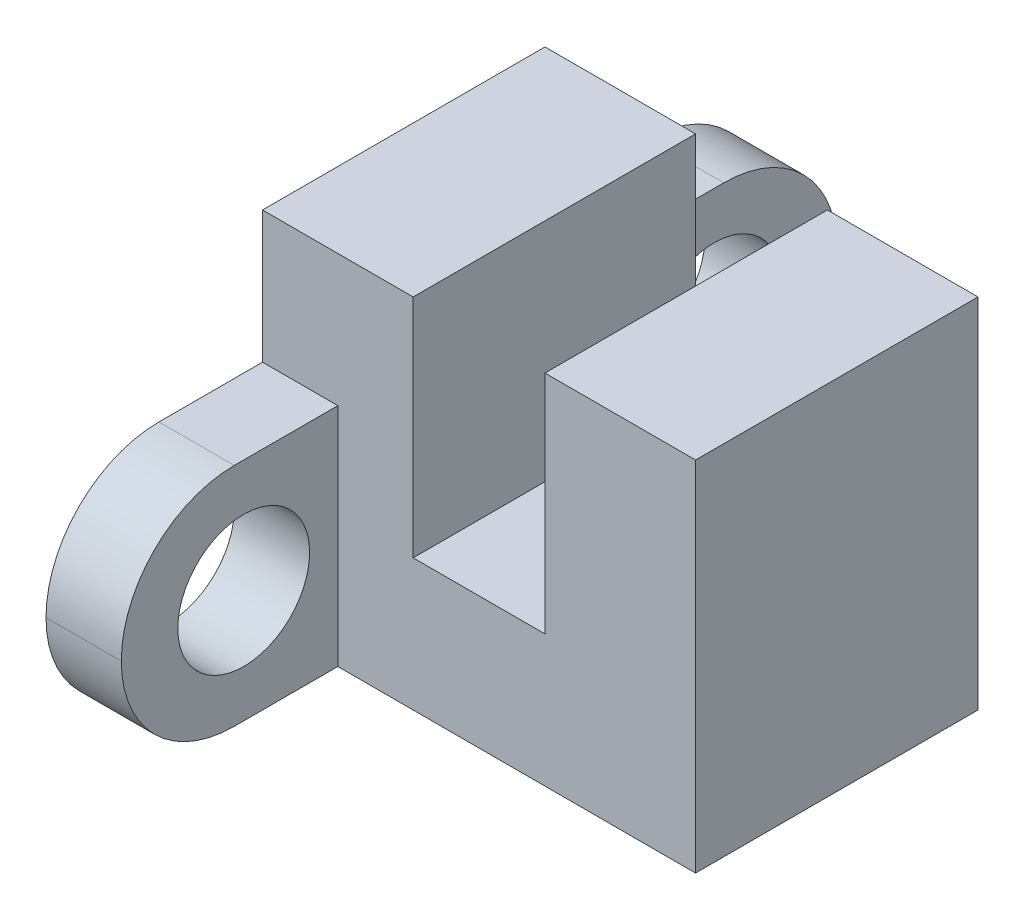
ISO-10303-21;
HEADER;
FILE_DESCRIPTION(('STEP AP214'),'2;1');
FILE_NAME('part.step','',(''),(''),'','','');
FILE_SCHEMA(('AUTOMOTIVE_DESIGN { 1 0 10303 214 1 1 1 1 }'));
ENDSEC;
DATA;
#1=APPLICATION_CONTEXT('core data for automotive mechanical design processes');
#2=APPLICATION_PROTOCOL_DEFINITION('international standard','automotive_design',2000,#1);
#3=PRODUCT_CONTEXT('',#1,'mechanical');
#4=PRODUCT('Part','Part','',(#3));
#5=PRODUCT_RELATED_PRODUCT_CATEGORY('part','',(#4));
#6=PRODUCT_DEFINITION_FORMATION('','',#4);
#7=PRODUCT_DEFINITION_CONTEXT('part definition',#1,'design');
#8=PRODUCT_DEFINITION('design','',#6,#7);
#9=PRODUCT_DEFINITION_SHAPE('','',#8);
#10=(LENGTH_UNIT() NAMED_UNIT(*) SI_UNIT(.MILLI.,.METRE.));
#11=(NAMED_UNIT(*) PLANE_ANGLE_UNIT() SI_UNIT($,.RADIAN.));
#12=(NAMED_UNIT(*) SI_UNIT($,.STERADIAN.) SOLID_ANGLE_UNIT());
#13=UNCERTAINTY_MEASURE_WITH_UNIT(LENGTH_MEASURE(1.E-05),#10,'distance_accuracy_value','');
#14=(GEOMETRIC_REPRESENTATION_CONTEXT(3) GLOBAL_UNCERTAINTY_ASSIGNED_CONTEXT((#13)) GLOBAL_UNIT_ASSIGNED_CONTEXT((#10,
#11,#12)) REPRESENTATION_CONTEXT('',''));
#15=CARTESIAN_POINT('',(0.,0.,0.));
#16=DIRECTION('',(0.,0.,1.));
#17=DIRECTION('',(1.,0.,0.));
#18=AXIS2_PLACEMENT_3D('',#15,#16,#17);
#19=CARTESIAN_POINT('',(0.,9.5,7.5));
#20=DIRECTION('',(0.,1.,0.));
#21=DIRECTION('',(0.,0.,1.));
#22=AXIS2_PLACEMENT_3D('',#19,#20,#21);
#23=PLANE('',#22);
#24=DIRECTION('',(1.,0.,0.));
#25=VECTOR('',#24,1.);
#26=CARTESIAN_POINT('',(0.,9.5,0.));
#27=LINE('',#26,#25);
#28=CARTESIAN_POINT('',(7.5,9.5,0.));
#29=VERTEX_POINT('',#28);
#30=CARTESIAN_POINT('',(11.5,9.5,0.));
#31=VERTEX_POINT('',#30);
#32=EDGE_CURVE('E188',#29,#31,#27,.T.);
#33=ORIENTED_EDGE('',*,*,#32,.F.);
#34=DIRECTION('',(0.,0.,-1.));
#35=VECTOR('',#34,1.);
#36=CARTESIAN_POINT('',(7.5,9.5,7.5));
#37=LINE('',#36,#35);
#38=CARTESIAN_POINT('',(7.5,9.5,7.5));
#39=VERTEX_POINT('',#38);
#40=EDGE_CURVE('E237',#39,#29,#37,.T.);
#41=ORIENTED_EDGE('',*,*,#40,.F.);
#42=DIRECTION('',(1.,0.,0.));
#43=VECTOR('',#42,1.);
#44=CARTESIAN_POINT('',(0.,9.5,7.5));
#45=LINE('',#44,#43);
#46=CARTESIAN_POINT('',(11.5,9.5,7.5));
#47=VERTEX_POINT('',#46);
#48=EDGE_CURVE('E189',#39,#47,#45,.T.);
#49=ORIENTED_EDGE('',*,*,#48,.T.);
#50=DIRECTION('',(0.,0.,-1.));
#51=VECTOR('',#50,1.);
#52=CARTESIAN_POINT('',(11.5,9.5,7.5));
#53=LINE('',#52,#51);
#54=EDGE_CURVE('E208',#47,#31,#53,.T.);
#55=ORIENTED_EDGE('',*,*,#54,.T.);
#56=EDGE_LOOP('',(#33,#41,#49,#55));
#57=FACE_BOUND('',#56,.T.);
#58=ADVANCED_FACE('F32',(#57),#23,.T.);
#59=CARTESIAN_POINT('',(7.5,0.,7.5));
#60=DIRECTION('',(1.,0.,0.));
#61=DIRECTION('',(0.,1.,0.));
#62=AXIS2_PLACEMENT_3D('',#59,#60,#61);
#63=PLANE('',#62);
#64=DIRECTION('',(0.,-1.,0.));
#65=VECTOR('',#64,1.);
#66=CARTESIAN_POINT('',(7.5,0.,0.));
#67=LINE('',#66,#65);
#68=CARTESIAN_POINT('',(7.5,3.5,0.));
#69=VERTEX_POINT('',#68);
#70=EDGE_CURVE('E211',#29,#69,#67,.T.);
#71=ORIENTED_EDGE('',*,*,#70,.T.);
#72=DIRECTION('',(0.,0.,-1.));
#73=VECTOR('',#72,1.);
#74=CARTESIAN_POINT('',(7.5,3.5,7.5));
#75=LINE('',#74,#73);
#76=CARTESIAN_POINT('',(7.5,3.5,7.5));
#77=VERTEX_POINT('',#76);
#78=EDGE_CURVE('E235',#77,#69,#75,.T.);
#79=ORIENTED_EDGE('',*,*,#78,.F.);
#80=DIRECTION('',(0.,-1.,0.));
#81=VECTOR('',#80,1.);
#82=CARTESIAN_POINT('',(7.5,0.,7.5));
#83=LINE('',#82,#81);
#84=EDGE_CURVE('E192',#39,#77,#83,.T.);
#85=ORIENTED_EDGE('',*,*,#84,.F.);
#86=ORIENTED_EDGE('',*,*,#40,.T.);
#87=EDGE_LOOP('',(#71,#79,#85,#86));
#88=FACE_BOUND('',#87,.T.);
#89=ADVANCED_FACE('F323',(#88),#63,.F.);
#90=CARTESIAN_POINT('',(0.,3.5,7.5));
#91=DIRECTION('',(0.,1.,0.));
#92=DIRECTION('',(0.,0.,1.));
#93=AXIS2_PLACEMENT_3D('',#90,#91,#92);
#94=PLANE('',#93);
#95=DIRECTION('',(1.,0.,0.));
#96=VECTOR('',#95,1.);
#97=CARTESIAN_POINT('',(0.,3.5,0.));
#98=LINE('',#97,#96);
#99=CARTESIAN_POINT('',(4.,3.5,0.));
#100=VERTEX_POINT('',#99);
#101=EDGE_CURVE('E214',#100,#69,#98,.T.);
#102=ORIENTED_EDGE('',*,*,#101,.F.);
#103=DIRECTION('',(0.,0.,-1.));
#104=VECTOR('',#103,1.);
#105=CARTESIAN_POINT('',(4.,3.5,7.5));
#106=LINE('',#105,#104);
#107=CARTESIAN_POINT('',(4.,3.5,7.5));
#108=VERTEX_POINT('',#107);
#109=EDGE_CURVE('E233',#108,#100,#106,.T.);
#110=ORIENTED_EDGE('',*,*,#109,.F.);
#111=DIRECTION('',(1.,0.,0.));
#112=VECTOR('',#111,1.);
#113=CARTESIAN_POINT('',(0.,3.5,7.5));
#114=LINE('',#113,#112);
#115=EDGE_CURVE('E196',#108,#77,#114,.T.);
#116=ORIENTED_EDGE('',*,*,#115,.T.);
#117=ORIENTED_EDGE('',*,*,#78,.T.);
#118=EDGE_LOOP('',(#102,#110,#116,#117));
#119=FACE_BOUND('',#118,.T.);
#120=ADVANCED_FACE('F328',(#119),#94,.T.);
#121=CARTESIAN_POINT('',(4.,0.,7.5));
#122=DIRECTION('',(1.,0.,0.));
#123=DIRECTION('',(0.,1.,0.));
#124=AXIS2_PLACEMENT_3D('',#121,#122,#123);
#125=PLANE('',#124);
#126=DIRECTION('',(0.,-1.,0.));
#127=VECTOR('',#126,1.);
#128=CARTESIAN_POINT('',(4.,0.,0.));
#129=LINE('',#128,#127);
#130=CARTESIAN_POINT('',(4.,9.5,0.));
#131=VERTEX_POINT('',#130);
#132=EDGE_CURVE('E217',#131,#100,#129,.T.);
#133=ORIENTED_EDGE('',*,*,#132,.F.);
#134=DIRECTION('',(0.,0.,-1.));
#135=VECTOR('',#134,1.);
#136=CARTESIAN_POINT('',(4.,9.5,7.5));
#137=LINE('',#136,#135);
#138=CARTESIAN_POINT('',(4.,9.5,7.5));
#139=VERTEX_POINT('',#138);
#140=EDGE_CURVE('E231',#139,#131,#137,.T.);
#141=ORIENTED_EDGE('',*,*,#140,.F.);
#142=DIRECTION('',(0.,-1.,0.));
#143=VECTOR('',#142,1.);
#144=CARTESIAN_POINT('',(4.,0.,7.5));
#145=LINE('',#144,#143);
#146=EDGE_CURVE('E199',#139,#108,#145,.T.);
#147=ORIENTED_EDGE('',*,*,#146,.T.);
#148=ORIENTED_EDGE('',*,*,#109,.T.);
#149=EDGE_LOOP('',(#133,#141,#147,#148));
#150=FACE_BOUND('',#149,.T.);
#151=ADVANCED_FACE('F319',(#150),#125,.T.);
#152=CARTESIAN_POINT('',(0.,9.5,0.));
#153=VERTEX_POINT('',#152);
#154=EDGE_CURVE('E158',#153,#131,#27,.T.);
#155=ORIENTED_EDGE('',*,*,#154,.F.);
#156=DIRECTION('',(0.,0.,-1.));
#157=VECTOR('',#156,1.);
#158=CARTESIAN_POINT('',(0.,9.5,7.5));
#159=LINE('',#158,#157);
#160=CARTESIAN_POINT('',(0.,9.5,7.5));
#161=VERTEX_POINT('',#160);
#162=EDGE_CURVE('E153',#161,#153,#159,.T.);
#163=ORIENTED_EDGE('',*,*,#162,.F.);
#164=EDGE_CURVE('E194',#161,#139,#45,.T.);
#165=ORIENTED_EDGE('',*,*,#164,.T.);
#166=ORIENTED_EDGE('',*,*,#140,.T.);
#167=EDGE_LOOP('',(#155,#163,#165,#166));
#168=FACE_BOUND('',#167,.T.);
#169=ADVANCED_FACE('F311',(#168),#23,.T.);
#170=CARTESIAN_POINT('',(0.,0.,7.5));
#171=DIRECTION('',(-1.,0.,0.));
#172=DIRECTION('',(0.,0.,1.));
#173=AXIS2_PLACEMENT_3D('',#170,#171,#172);
#174=PLANE('',#173);
#175=DIRECTION('',(0.,0.,-1.));
#176=VECTOR('',#175,1.);
#177=CARTESIAN_POINT('',(0.,0.,7.5));
#178=LINE('',#177,#176);
#179=CARTESIAN_POINT('',(0.,0.,10.25));
#180=VERTEX_POINT('',#179);
#181=CARTESIAN_POINT('',(0.,0.,-2.75));
#182=VERTEX_POINT('',#181);
#183=EDGE_CURVE('E227',#180,#182,#178,.T.);
#184=ORIENTED_EDGE('',*,*,#183,.F.);
#185=CARTESIAN_POINT('',(0.,3.,10.25));
#186=DIRECTION('',(-1.,0.,0.));
#187=DIRECTION('',(0.,0.,1.));
#188=AXIS2_PLACEMENT_3D('',#185,#186,#187);
#189=CIRCLE('',#188,3.);
#190=CARTESIAN_POINT('',(0.,3.,13.25));
#191=VERTEX_POINT('',#190);
#192=EDGE_CURVE('E251',#180,#191,#189,.T.);
#193=ORIENTED_EDGE('',*,*,#192,.T.);
#194=CARTESIAN_POINT('',(0.,3.,10.25));
#195=DIRECTION('',(-1.,0.,0.));
#196=DIRECTION('',(0.,0.,1.));
#197=AXIS2_PLACEMENT_3D('',#194,#195,#196);
#198=CIRCLE('',#197,3.);
#199=CARTESIAN_POINT('',(0.,6.,10.25));
#200=VERTEX_POINT('',#199);
#201=EDGE_CURVE('E249',#191,#200,#198,.T.);
#202=ORIENTED_EDGE('',*,*,#201,.T.);
#203=DIRECTION('',(0.,0.,-1.));
#204=VECTOR('',#203,1.);
#205=CARTESIAN_POINT('',(0.,6.,-5.75));
#206=LINE('',#205,#204);
#207=CARTESIAN_POINT('',(0.,6.,7.5));
#208=VERTEX_POINT('',#207);
#209=EDGE_CURVE('E171',#200,#208,#206,.T.);
#210=ORIENTED_EDGE('',*,*,#209,.T.);
#211=DIRECTION('',(0.,1.,0.));
#212=VECTOR('',#211,1.);
#213=CARTESIAN_POINT('',(0.,0.,7.5));
#214=LINE('',#213,#212);
#215=EDGE_CURVE('E202',#208,#161,#214,.T.);
#216=ORIENTED_EDGE('',*,*,#215,.T.);
#217=ORIENTED_EDGE('',*,*,#162,.T.);
#218=DIRECTION('',(0.,1.,0.));
#219=VECTOR('',#218,1.);
#220=CARTESIAN_POINT('',(0.,0.,0.));
#221=LINE('',#220,#219);
#222=CARTESIAN_POINT('',(0.,6.,0.));
#223=VERTEX_POINT('',#222);
#224=EDGE_CURVE('E144',#223,#153,#221,.T.);
#225=ORIENTED_EDGE('',*,*,#224,.F.);
#226=CARTESIAN_POINT('',(0.,6.,-2.75));
#227=VERTEX_POINT('',#226);
#228=EDGE_CURVE('E150',#223,#227,#206,.T.);
#229=ORIENTED_EDGE('',*,*,#228,.T.);
#230=CARTESIAN_POINT('',(0.,3.,-2.75));
#231=DIRECTION('',(-1.,0.,0.));
#232=DIRECTION('',(0.,0.,1.));
#233=AXIS2_PLACEMENT_3D('',#230,#231,#232);
#234=CIRCLE('',#233,3.);
#235=CARTESIAN_POINT('',(0.,3.,-5.75));
#236=VERTEX_POINT('',#235);
#237=EDGE_CURVE('E245',#227,#236,#234,.T.);
#238=ORIENTED_EDGE('',*,*,#237,.T.);
#239=CARTESIAN_POINT('',(0.,3.,-2.75));
#240=DIRECTION('',(-1.,0.,0.));
#241=DIRECTION('',(0.,0.,1.));
#242=AXIS2_PLACEMENT_3D('',#239,#240,#241);
#243=CIRCLE('',#242,3.);
#244=EDGE_CURVE('E247',#236,#182,#243,.T.);
#245=ORIENTED_EDGE('',*,*,#244,.T.);
#246=EDGE_LOOP('',(#184,#193,#202,#210,#216,#217,#225,#229,#238,#245));
#247=FACE_BOUND('',#246,.T.);
#248=CARTESIAN_POINT('',(0.,3.,-2.5));
#249=DIRECTION('',(-1.,0.,0.));
#250=DIRECTION('',(0.,0.,1.));
#251=AXIS2_PLACEMENT_3D('',#248,#249,#250);
#252=CIRCLE('',#251,1.75);
#253=CARTESIAN_POINT('',(0.,3.,-0.749999999999999));
#254=VERTEX_POINT('',#253);
#255=EDGE_CURVE('E176',#254,#254,#252,.T.);
#256=ORIENTED_EDGE('',*,*,#255,.F.);
#257=EDGE_LOOP('',(#256));
#258=FACE_BOUND('',#257,.T.);
#259=CARTESIAN_POINT('',(0.,3.,10.));
#260=DIRECTION('',(-1.,0.,0.));
#261=DIRECTION('',(0.,0.,1.));
#262=AXIS2_PLACEMENT_3D('',#259,#260,#261);
#263=CIRCLE('',#262,1.75);
#264=CARTESIAN_POINT('',(0.,3.,11.75));
#265=VERTEX_POINT('',#264);
#266=EDGE_CURVE('E262',#265,#265,#263,.T.);
#267=ORIENTED_EDGE('',*,*,#266,.F.);
#268=EDGE_LOOP('',(#267));
#269=FACE_BOUND('',#268,.T.);
#270=ADVANCED_FACE('F147',(#247,#258,#269),#174,.T.);
#271=CARTESIAN_POINT('',(0.,0.,7.5));
#272=DIRECTION('',(0.,1.,0.));
#273=DIRECTION('',(0.,0.,1.));
#274=AXIS2_PLACEMENT_3D('',#271,#272,#273);
#275=PLANE('',#274);
#276=DIRECTION('',(0.,0.,1.));
#277=VECTOR('',#276,1.);
#278=CARTESIAN_POINT('',(2.,0.,-5.75));
#279=LINE('',#278,#277);
#280=CARTESIAN_POINT('',(2.,0.,7.5));
#281=VERTEX_POINT('',#280);
#282=CARTESIAN_POINT('',(2.,0.,10.25));
#283=VERTEX_POINT('',#282);
#284=EDGE_CURVE('E174',#281,#283,#279,.T.);
#285=ORIENTED_EDGE('',*,*,#284,.T.);
#286=DIRECTION('',(-1.,0.,0.));
#287=VECTOR('',#286,1.);
#288=CARTESIAN_POINT('',(0.,0.,10.25));
#289=LINE('',#288,#287);
#290=EDGE_CURVE('E242',#283,#180,#289,.T.);
#291=ORIENTED_EDGE('',*,*,#290,.T.);
#292=ORIENTED_EDGE('',*,*,#183,.T.);
#293=DIRECTION('',(-1.,0.,0.));
#294=VECTOR('',#293,1.);
#295=CARTESIAN_POINT('',(2.,0.,-2.75));
#296=LINE('',#295,#294);
#297=CARTESIAN_POINT('',(2.,0.,-2.75));
#298=VERTEX_POINT('',#297);
#299=EDGE_CURVE('E167',#182,#298,#296,.F.);
#300=ORIENTED_EDGE('',*,*,#299,.T.);
#301=CARTESIAN_POINT('',(2.,0.,0.));
#302=VERTEX_POINT('',#301);
#303=EDGE_CURVE('E296',#298,#302,#279,.T.);
#304=ORIENTED_EDGE('',*,*,#303,.T.);
#305=DIRECTION('',(1.,0.,0.));
#306=VECTOR('',#305,1.);
#307=CARTESIAN_POINT('',(0.,0.,0.));
#308=LINE('',#307,#306);
#309=CARTESIAN_POINT('',(11.5,0.,0.));
#310=VERTEX_POINT('',#309);
#311=EDGE_CURVE('E157',#302,#310,#308,.T.);
#312=ORIENTED_EDGE('',*,*,#311,.T.);
#313=DIRECTION('',(0.,0.,-1.));
#314=VECTOR('',#313,1.);
#315=CARTESIAN_POINT('',(11.5,0.,7.5));
#316=LINE('',#315,#314);
#317=CARTESIAN_POINT('',(11.5,0.,7.5));
#318=VERTEX_POINT('',#317);
#319=EDGE_CURVE('E224',#318,#310,#316,.T.);
#320=ORIENTED_EDGE('',*,*,#319,.F.);
#321=DIRECTION('',(1.,0.,0.));
#322=VECTOR('',#321,1.);
#323=CARTESIAN_POINT('',(0.,0.,7.5));
#324=LINE('',#323,#322);
#325=EDGE_CURVE('E204',#281,#318,#324,.T.);
#326=ORIENTED_EDGE('',*,*,#325,.F.);
#327=EDGE_LOOP('',(#285,#291,#292,#300,#304,#312,#320,#326));
#328=FACE_BOUND('',#327,.T.);
#329=ADVANCED_FACE('F278',(#328),#275,.F.);
#330=CARTESIAN_POINT('',(11.5,0.,7.5));
#331=DIRECTION('',(-1.,0.,0.));
#332=DIRECTION('',(0.,0.,1.));
#333=AXIS2_PLACEMENT_3D('',#330,#331,#332);
#334=PLANE('',#333);
#335=DIRECTION('',(0.,1.,0.));
#336=VECTOR('',#335,1.);
#337=CARTESIAN_POINT('',(11.5,0.,0.));
#338=LINE('',#337,#336);
#339=EDGE_CURVE('E193',#310,#31,#338,.T.);
#340=ORIENTED_EDGE('',*,*,#339,.T.);
#341=ORIENTED_EDGE('',*,*,#54,.F.);
#342=DIRECTION('',(0.,1.,0.));
#343=VECTOR('',#342,1.);
#344=CARTESIAN_POINT('',(11.5,0.,7.5));
#345=LINE('',#344,#343);
#346=EDGE_CURVE('E206',#318,#47,#345,.T.);
#347=ORIENTED_EDGE('',*,*,#346,.F.);
#348=ORIENTED_EDGE('',*,*,#319,.T.);
#349=EDGE_LOOP('',(#340,#341,#347,#348));
#350=FACE_BOUND('',#349,.T.);
#351=ADVANCED_FACE('F317',(#350),#334,.F.);
#352=CARTESIAN_POINT('',(0.,0.,7.5));
#353=DIRECTION('',(0.,0.,1.));
#354=DIRECTION('',(1.,0.,0.));
#355=AXIS2_PLACEMENT_3D('',#352,#353,#354);
#356=PLANE('',#355);
#357=DIRECTION('',(-1.,0.,0.));
#358=VECTOR('',#357,1.);
#359=CARTESIAN_POINT('',(0.,6.,7.5));
#360=LINE('',#359,#358);
#361=CARTESIAN_POINT('',(2.,6.,7.5));
#362=VERTEX_POINT('',#361);
#363=EDGE_CURVE('E185',#362,#208,#360,.T.);
#364=ORIENTED_EDGE('',*,*,#363,.F.);
#365=DIRECTION('',(0.,1.,0.));
#366=VECTOR('',#365,1.);
#367=CARTESIAN_POINT('',(2.,0.,7.5));
#368=LINE('',#367,#366);
#369=EDGE_CURVE('E182',#281,#362,#368,.T.);
#370=ORIENTED_EDGE('',*,*,#369,.F.);
#371=ORIENTED_EDGE('',*,*,#325,.T.);
#372=ORIENTED_EDGE('',*,*,#346,.T.);
#373=ORIENTED_EDGE('',*,*,#48,.F.);
#374=ORIENTED_EDGE('',*,*,#84,.T.);
#375=ORIENTED_EDGE('',*,*,#115,.F.);
#376=ORIENTED_EDGE('',*,*,#146,.F.);
#377=ORIENTED_EDGE('',*,*,#164,.F.);
#378=ORIENTED_EDGE('',*,*,#215,.F.);
#379=EDGE_LOOP('',(#364,#370,#371,#372,#373,#374,#375,#376,#377,#378));
#380=FACE_BOUND('',#379,.T.);
#381=ADVANCED_FACE('F399',(#380),#356,.T.);
#382=CARTESIAN_POINT('',(0.,0.,0.));
#383=DIRECTION('',(0.,0.,1.));
#384=DIRECTION('',(1.,0.,0.));
#385=AXIS2_PLACEMENT_3D('',#382,#383,#384);
#386=PLANE('',#385);
#387=DIRECTION('',(0.,1.,0.));
#388=VECTOR('',#387,1.);
#389=CARTESIAN_POINT('',(2.,0.,0.));
#390=LINE('',#389,#388);
#391=CARTESIAN_POINT('',(2.,6.,0.));
#392=VERTEX_POINT('',#391);
#393=EDGE_CURVE('E165',#302,#392,#390,.T.);
#394=ORIENTED_EDGE('',*,*,#393,.T.);
#395=DIRECTION('',(-1.,0.,0.));
#396=VECTOR('',#395,1.);
#397=CARTESIAN_POINT('',(0.,6.,0.));
#398=LINE('',#397,#396);
#399=EDGE_CURVE('E161',#392,#223,#398,.T.);
#400=ORIENTED_EDGE('',*,*,#399,.T.);
#401=ORIENTED_EDGE('',*,*,#224,.T.);
#402=ORIENTED_EDGE('',*,*,#154,.T.);
#403=ORIENTED_EDGE('',*,*,#132,.T.);
#404=ORIENTED_EDGE('',*,*,#101,.T.);
#405=ORIENTED_EDGE('',*,*,#70,.F.);
#406=ORIENTED_EDGE('',*,*,#32,.T.);
#407=ORIENTED_EDGE('',*,*,#339,.F.);
#408=ORIENTED_EDGE('',*,*,#311,.F.);
#409=EDGE_LOOP('',(#394,#400,#401,#402,#403,#404,#405,#406,#407,#408));
#410=FACE_BOUND('',#409,.T.);
#411=ADVANCED_FACE('F162',(#410),#386,.F.);
#412=CARTESIAN_POINT('',(2.,3.,-2.5));
#413=DIRECTION('',(-1.,0.,0.));
#414=DIRECTION('',(0.,0.,1.));
#415=AXIS2_PLACEMENT_3D('',#412,#413,#414);
#416=CYLINDRICAL_SURFACE('',#415,1.75);
#417=CARTESIAN_POINT('',(2.,3.,-2.5));
#418=DIRECTION('',(-1.,0.,0.));
#419=DIRECTION('',(0.,0.,1.));
#420=AXIS2_PLACEMENT_3D('',#417,#418,#419);
#421=CIRCLE('',#420,1.75);
#422=CARTESIAN_POINT('',(2.,3.,-0.749999999999999));
#423=VERTEX_POINT('',#422);
#424=EDGE_CURVE('E172',#423,#423,#421,.T.);
#425=ORIENTED_EDGE('',*,*,#424,.F.);
#426=EDGE_LOOP('',(#425));
#427=FACE_BOUND('',#426,.T.);
#428=ORIENTED_EDGE('',*,*,#255,.T.);
#429=EDGE_LOOP('',(#428));
#430=FACE_BOUND('',#429,.T.);
#431=ADVANCED_FACE('F385',(#427,#430),#416,.F.);
#432=CARTESIAN_POINT('',(2.,0.,0.));
#433=DIRECTION('',(1.,0.,0.));
#434=DIRECTION('',(0.,0.,-1.));
#435=AXIS2_PLACEMENT_3D('',#432,#433,#434);
#436=PLANE('',#435);
#437=ORIENTED_EDGE('',*,*,#424,.T.);
#438=EDGE_LOOP('',(#437));
#439=FACE_BOUND('',#438,.T.);
#440=ORIENTED_EDGE('',*,*,#303,.F.);
#441=CARTESIAN_POINT('',(2.,3.,-2.75));
#442=DIRECTION('',(1.,0.,0.));
#443=DIRECTION('',(0.,0.,-1.));
#444=AXIS2_PLACEMENT_3D('',#441,#442,#443);
#445=CIRCLE('',#444,3.);
#446=CARTESIAN_POINT('',(2.,3.,-5.75));
#447=VERTEX_POINT('',#446);
#448=EDGE_CURVE('E41',#298,#447,#445,.T.);
#449=ORIENTED_EDGE('',*,*,#448,.T.);
#450=CARTESIAN_POINT('',(2.,3.,-2.75));
#451=DIRECTION('',(1.,0.,0.));
#452=DIRECTION('',(0.,0.,-1.));
#453=AXIS2_PLACEMENT_3D('',#450,#451,#452);
#454=CIRCLE('',#453,3.);
#455=CARTESIAN_POINT('',(2.,6.,-2.75));
#456=VERTEX_POINT('',#455);
#457=EDGE_CURVE('E49',#447,#456,#454,.T.);
#458=ORIENTED_EDGE('',*,*,#457,.T.);
#459=DIRECTION('',(0.,0.,-1.));
#460=VECTOR('',#459,1.);
#461=CARTESIAN_POINT('',(2.,6.,-5.75));
#462=LINE('',#461,#460);
#463=EDGE_CURVE('E295',#392,#456,#462,.T.);
#464=ORIENTED_EDGE('',*,*,#463,.F.);
#465=ORIENTED_EDGE('',*,*,#393,.F.);
#466=EDGE_LOOP('',(#440,#449,#458,#464,#465));
#467=FACE_BOUND('',#466,.T.);
#468=ADVANCED_FACE('F368',(#439,#467),#436,.T.);
#469=CARTESIAN_POINT('',(2.,6.,-5.75));
#470=DIRECTION('',(0.,1.,0.));
#471=DIRECTION('',(0.,0.,1.));
#472=AXIS2_PLACEMENT_3D('',#469,#470,#471);
#473=PLANE('',#472);
#474=ORIENTED_EDGE('',*,*,#463,.T.);
#475=DIRECTION('',(-1.,0.,0.));
#476=VECTOR('',#475,1.);
#477=CARTESIAN_POINT('',(2.,6.,-2.75));
#478=LINE('',#477,#476);
#479=EDGE_CURVE('E11',#456,#227,#478,.T.);
#480=ORIENTED_EDGE('',*,*,#479,.T.);
#481=ORIENTED_EDGE('',*,*,#228,.F.);
#482=ORIENTED_EDGE('',*,*,#399,.F.);
#483=EDGE_LOOP('',(#474,#480,#481,#482));
#484=FACE_BOUND('',#483,.T.);
#485=ADVANCED_FACE('F169',(#484),#473,.T.);
#486=ORIENTED_EDGE('',*,*,#209,.F.);
#487=DIRECTION('',(-1.,0.,0.));
#488=VECTOR('',#487,1.);
#489=CARTESIAN_POINT('',(2.,6.,10.25));
#490=LINE('',#489,#488);
#491=CARTESIAN_POINT('',(2.,6.,10.25));
#492=VERTEX_POINT('',#491);
#493=EDGE_CURVE('E257',#200,#492,#490,.F.);
#494=ORIENTED_EDGE('',*,*,#493,.T.);
#495=EDGE_CURVE('E180',#492,#362,#462,.T.);
#496=ORIENTED_EDGE('',*,*,#495,.T.);
#497=ORIENTED_EDGE('',*,*,#363,.T.);
#498=EDGE_LOOP('',(#486,#494,#496,#497));
#499=FACE_BOUND('',#498,.T.);
#500=ADVANCED_FACE('F290',(#499),#473,.T.);
#501=CARTESIAN_POINT('',(2.,3.,10.));
#502=DIRECTION('',(-1.,0.,0.));
#503=DIRECTION('',(0.,0.,1.));
#504=AXIS2_PLACEMENT_3D('',#501,#502,#503);
#505=CIRCLE('',#504,1.75);
#506=CARTESIAN_POINT('',(2.,3.,11.75));
#507=VERTEX_POINT('',#506);
#508=EDGE_CURVE('E267',#507,#507,#505,.T.);
#509=ORIENTED_EDGE('',*,*,#508,.T.);
#510=EDGE_LOOP('',(#509));
#511=FACE_BOUND('',#510,.T.);
#512=CARTESIAN_POINT('',(2.,3.,10.25));
#513=DIRECTION('',(1.,0.,0.));
#514=DIRECTION('',(0.,0.,-1.));
#515=AXIS2_PLACEMENT_3D('',#512,#513,#514);
#516=CIRCLE('',#515,3.);
#517=CARTESIAN_POINT('',(2.,3.,13.25));
#518=VERTEX_POINT('',#517);
#519=EDGE_CURVE('E253',#492,#518,#516,.T.);
#520=ORIENTED_EDGE('',*,*,#519,.T.);
#521=CARTESIAN_POINT('',(2.,3.,10.25));
#522=DIRECTION('',(1.,0.,0.));
#523=DIRECTION('',(0.,0.,-1.));
#524=AXIS2_PLACEMENT_3D('',#521,#522,#523);
#525=CIRCLE('',#524,3.);
#526=EDGE_CURVE('E255',#518,#283,#525,.T.);
#527=ORIENTED_EDGE('',*,*,#526,.T.);
#528=ORIENTED_EDGE('',*,*,#284,.F.);
#529=ORIENTED_EDGE('',*,*,#369,.T.);
#530=ORIENTED_EDGE('',*,*,#495,.F.);
#531=EDGE_LOOP('',(#520,#527,#528,#529,#530));
#532=FACE_BOUND('',#531,.T.);
#533=ADVANCED_FACE('F292',(#511,#532),#436,.T.);
#534=CARTESIAN_POINT('',(2.,3.,10.));
#535=DIRECTION('',(-1.,0.,0.));
#536=DIRECTION('',(0.,0.,1.));
#537=AXIS2_PLACEMENT_3D('',#534,#535,#536);
#538=CYLINDRICAL_SURFACE('',#537,1.75);
#539=ORIENTED_EDGE('',*,*,#508,.F.);
#540=EDGE_LOOP('',(#539));
#541=FACE_BOUND('',#540,.T.);
#542=ORIENTED_EDGE('',*,*,#266,.T.);
#543=EDGE_LOOP('',(#542));
#544=FACE_BOUND('',#543,.T.);
#545=ADVANCED_FACE('F304',(#541,#544),#538,.F.);
#546=CARTESIAN_POINT('',(2.,3.,10.25));
#547=DIRECTION('',(-1.,0.,0.));
#548=DIRECTION('',(0.,0.,1.));
#549=AXIS2_PLACEMENT_3D('',#546,#547,#548);
#550=CYLINDRICAL_SURFACE('',#549,3.);
#551=DIRECTION('',(-1.,0.,0.));
#552=VECTOR('',#551,1.);
#553=CARTESIAN_POINT('',(2.,3.,13.25));
#554=LINE('',#553,#552);
#555=EDGE_CURVE('E260',#518,#191,#554,.T.);
#556=ORIENTED_EDGE('',*,*,#555,.F.);
#557=ORIENTED_EDGE('',*,*,#519,.F.);
#558=ORIENTED_EDGE('',*,*,#493,.F.);
#559=ORIENTED_EDGE('',*,*,#201,.F.);
#560=EDGE_LOOP('',(#556,#557,#558,#559));
#561=FACE_BOUND('',#560,.T.);
#562=ADVANCED_FACE('F286',(#561),#550,.T.);
#563=CARTESIAN_POINT('',(0.,3.,10.25));
#564=DIRECTION('',(1.,0.,0.));
#565=DIRECTION('',(0.,0.,-1.));
#566=AXIS2_PLACEMENT_3D('',#563,#564,#565);
#567=CYLINDRICAL_SURFACE('',#566,3.);
#568=ORIENTED_EDGE('',*,*,#526,.F.);
#569=ORIENTED_EDGE('',*,*,#555,.T.);
#570=ORIENTED_EDGE('',*,*,#192,.F.);
#571=ORIENTED_EDGE('',*,*,#290,.F.);
#572=EDGE_LOOP('',(#568,#569,#570,#571));
#573=FACE_BOUND('',#572,.T.);
#574=ADVANCED_FACE('F281',(#573),#567,.T.);
#575=CARTESIAN_POINT('',(2.,3.,-2.75));
#576=DIRECTION('',(-1.,0.,0.));
#577=DIRECTION('',(0.,0.,1.));
#578=AXIS2_PLACEMENT_3D('',#575,#576,#577);
#579=CYLINDRICAL_SURFACE('',#578,3.);
#580=ORIENTED_EDGE('',*,*,#479,.F.);
#581=ORIENTED_EDGE('',*,*,#457,.F.);
#582=DIRECTION('',(-1.,0.,0.));
#583=VECTOR('',#582,1.);
#584=CARTESIAN_POINT('',(2.,3.,-5.75));
#585=LINE('',#584,#583);
#586=EDGE_CURVE('E36',#236,#447,#585,.F.);
#587=ORIENTED_EDGE('',*,*,#586,.F.);
#588=ORIENTED_EDGE('',*,*,#237,.F.);
#589=EDGE_LOOP('',(#580,#581,#587,#588));
#590=FACE_BOUND('',#589,.T.);
#591=ADVANCED_FACE('F34',(#590),#579,.T.);
#592=CARTESIAN_POINT('',(2.,3.,-2.75));
#593=DIRECTION('',(1.,0.,0.));
#594=DIRECTION('',(0.,0.,-1.));
#595=AXIS2_PLACEMENT_3D('',#592,#593,#594);
#596=CYLINDRICAL_SURFACE('',#595,3.);
#597=ORIENTED_EDGE('',*,*,#448,.F.);
#598=ORIENTED_EDGE('',*,*,#299,.F.);
#599=ORIENTED_EDGE('',*,*,#244,.F.);
#600=ORIENTED_EDGE('',*,*,#586,.T.);
#601=EDGE_LOOP('',(#597,#598,#599,#600));
#602=FACE_BOUND('',#601,.T.);
#603=ADVANCED_FACE('F273',(#602),#596,.T.);
#604=CLOSED_SHELL('',(#58,#89,#120,#151,#169,#270,#329,#351,#381,#411,#431,#468,#485,#500,#533,
#545,#562,#574,#591,#603));
#605=MANIFOLD_SOLID_BREP('B2',#604);
#606=ADVANCED_BREP_SHAPE_REPRESENTATION('',(#18,#605),#14);
#607=SHAPE_DEFINITION_REPRESENTATION(#9,#606);
ENDSEC;
END-ISO-10303-21;
